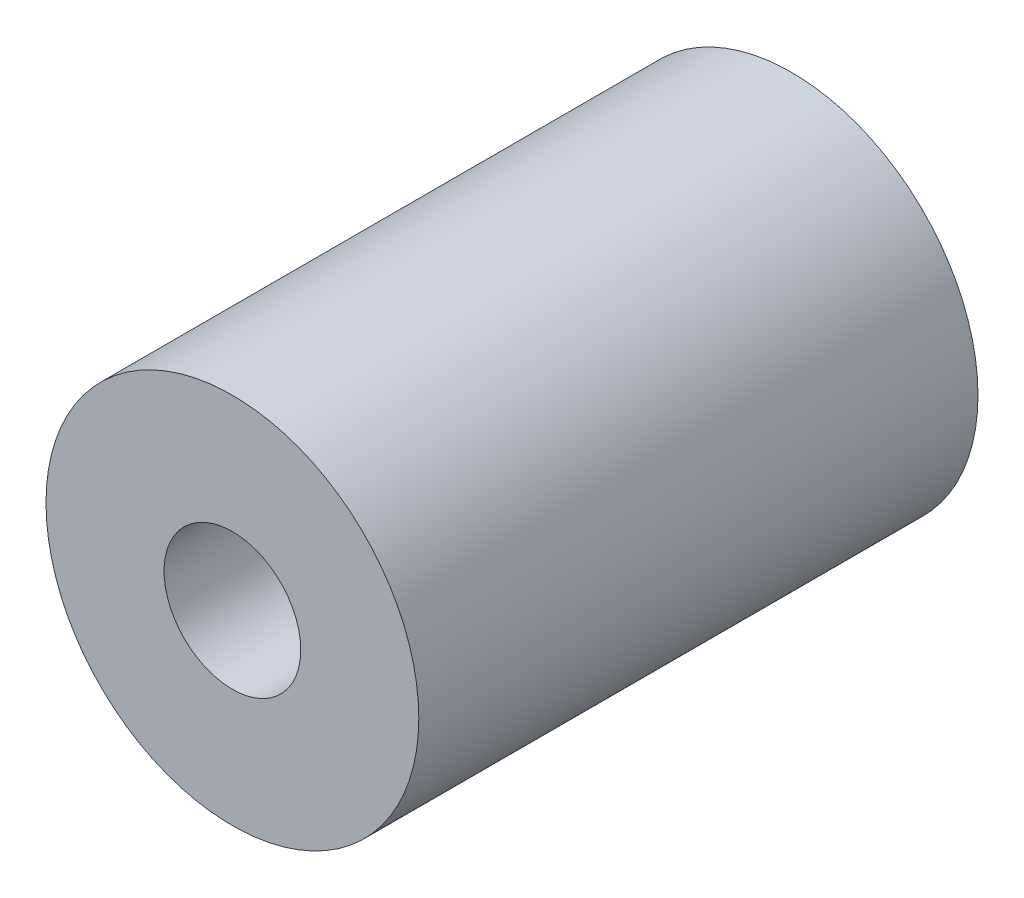
ISO-10303-21;
HEADER;
FILE_DESCRIPTION(('STEP AP214'),'2;1');
FILE_NAME('part.step','',(''),(''),'','','');
FILE_SCHEMA(('AUTOMOTIVE_DESIGN { 1 0 10303 214 1 1 1 1 }'));
ENDSEC;
DATA;
#1=APPLICATION_CONTEXT('core data for automotive mechanical design processes');
#2=APPLICATION_PROTOCOL_DEFINITION('international standard','automotive_design',2000,#1);
#3=PRODUCT_CONTEXT('',#1,'mechanical');
#4=PRODUCT('Part','Part','',(#3));
#5=PRODUCT_RELATED_PRODUCT_CATEGORY('part','',(#4));
#6=PRODUCT_DEFINITION_FORMATION('','',#4);
#7=PRODUCT_DEFINITION_CONTEXT('part definition',#1,'design');
#8=PRODUCT_DEFINITION('design','',#6,#7);
#9=PRODUCT_DEFINITION_SHAPE('','',#8);
#10=(LENGTH_UNIT() NAMED_UNIT(*) SI_UNIT(.MILLI.,.METRE.));
#11=(NAMED_UNIT(*) PLANE_ANGLE_UNIT() SI_UNIT($,.RADIAN.));
#12=(NAMED_UNIT(*) SI_UNIT($,.STERADIAN.) SOLID_ANGLE_UNIT());
#13=UNCERTAINTY_MEASURE_WITH_UNIT(LENGTH_MEASURE(1.E-05),#10,'distance_accuracy_value','');
#14=(GEOMETRIC_REPRESENTATION_CONTEXT(3) GLOBAL_UNCERTAINTY_ASSIGNED_CONTEXT((#13)) GLOBAL_UNIT_ASSIGNED_CONTEXT((#10,
#11,#12)) REPRESENTATION_CONTEXT('',''));
#15=CARTESIAN_POINT('',(0.,0.,0.));
#16=DIRECTION('',(0.,0.,1.));
#17=DIRECTION('',(1.,0.,0.));
#18=AXIS2_PLACEMENT_3D('',#15,#16,#17);
#19=CARTESIAN_POINT('',(0.,0.,11.43));
#20=DIRECTION('',(0.,0.,1.));
#21=DIRECTION('',(1.,0.,0.));
#22=AXIS2_PLACEMENT_3D('',#19,#20,#21);
#23=PLANE('',#22);
#24=CARTESIAN_POINT('',(0.,0.,11.43));
#25=DIRECTION('',(0.,0.,1.));
#26=DIRECTION('',(1.,0.,0.));
#27=AXIS2_PLACEMENT_3D('',#24,#25,#26);
#28=CIRCLE('',#27,3.81);
#29=CARTESIAN_POINT('',(3.81,0.,11.43));
#30=VERTEX_POINT('',#29);
#31=EDGE_CURVE('E10',#30,#30,#28,.T.);
#32=ORIENTED_EDGE('',*,*,#31,.T.);
#33=EDGE_LOOP('',(#32));
#34=FACE_BOUND('',#33,.T.);
#35=CARTESIAN_POINT('',(0.,0.,11.43));
#36=DIRECTION('',(0.,0.,1.));
#37=DIRECTION('',(1.,0.,0.));
#38=AXIS2_PLACEMENT_3D('',#35,#36,#37);
#39=CIRCLE('',#38,1.397);
#40=CARTESIAN_POINT('',(1.397,0.,11.43));
#41=VERTEX_POINT('',#40);
#42=EDGE_CURVE('E42',#41,#41,#39,.T.);
#43=ORIENTED_EDGE('',*,*,#42,.F.);
#44=EDGE_LOOP('',(#43));
#45=FACE_BOUND('',#44,.T.);
#46=ADVANCED_FACE('F31',(#34,#45),#23,.T.);
#47=CARTESIAN_POINT('',(0.,0.,0.));
#48=DIRECTION('',(0.,0.,1.));
#49=DIRECTION('',(1.,0.,0.));
#50=AXIS2_PLACEMENT_3D('',#47,#48,#49);
#51=PLANE('',#50);
#52=CARTESIAN_POINT('',(0.,0.,0.));
#53=DIRECTION('',(0.,0.,1.));
#54=DIRECTION('',(1.,0.,0.));
#55=AXIS2_PLACEMENT_3D('',#52,#53,#54);
#56=CIRCLE('',#55,3.81);
#57=CARTESIAN_POINT('',(3.81,0.,0.));
#58=VERTEX_POINT('',#57);
#59=EDGE_CURVE('E35',#58,#58,#56,.T.);
#60=ORIENTED_EDGE('',*,*,#59,.F.);
#61=EDGE_LOOP('',(#60));
#62=FACE_BOUND('',#61,.T.);
#63=CARTESIAN_POINT('',(0.,0.,0.));
#64=DIRECTION('',(0.,0.,1.));
#65=DIRECTION('',(1.,0.,0.));
#66=AXIS2_PLACEMENT_3D('',#63,#64,#65);
#67=CIRCLE('',#66,1.397);
#68=CARTESIAN_POINT('',(1.397,0.,0.));
#69=VERTEX_POINT('',#68);
#70=EDGE_CURVE('E44',#69,#69,#67,.T.);
#71=ORIENTED_EDGE('',*,*,#70,.T.);
#72=EDGE_LOOP('',(#71));
#73=FACE_BOUND('',#72,.T.);
#74=ADVANCED_FACE('F54',(#62,#73),#51,.F.);
#75=CARTESIAN_POINT('',(0.,0.,11.43));
#76=DIRECTION('',(0.,0.,-1.));
#77=DIRECTION('',(-1.,0.,0.));
#78=AXIS2_PLACEMENT_3D('',#75,#76,#77);
#79=CYLINDRICAL_SURFACE('',#78,3.81);
#80=ORIENTED_EDGE('',*,*,#31,.F.);
#81=EDGE_LOOP('',(#80));
#82=FACE_BOUND('',#81,.T.);
#83=ORIENTED_EDGE('',*,*,#59,.T.);
#84=EDGE_LOOP('',(#83));
#85=FACE_BOUND('',#84,.T.);
#86=ADVANCED_FACE('F33',(#82,#85),#79,.T.);
#87=CARTESIAN_POINT('',(0.,0.,11.43));
#88=DIRECTION('',(0.,0.,-1.));
#89=DIRECTION('',(-1.,0.,0.));
#90=AXIS2_PLACEMENT_3D('',#87,#88,#89);
#91=CYLINDRICAL_SURFACE('',#90,1.397);
#92=ORIENTED_EDGE('',*,*,#42,.T.);
#93=EDGE_LOOP('',(#92));
#94=FACE_BOUND('',#93,.T.);
#95=ORIENTED_EDGE('',*,*,#70,.F.);
#96=EDGE_LOOP('',(#95));
#97=FACE_BOUND('',#96,.T.);
#98=ADVANCED_FACE('F50',(#94,#97),#91,.F.);
#99=CLOSED_SHELL('',(#46,#74,#86,#98));
#100=MANIFOLD_SOLID_BREP('B2',#99);
#101=ADVANCED_BREP_SHAPE_REPRESENTATION('',(#18,#100),#14);
#102=SHAPE_DEFINITION_REPRESENTATION(#9,#101);
ENDSEC;
END-ISO-10303-21;
